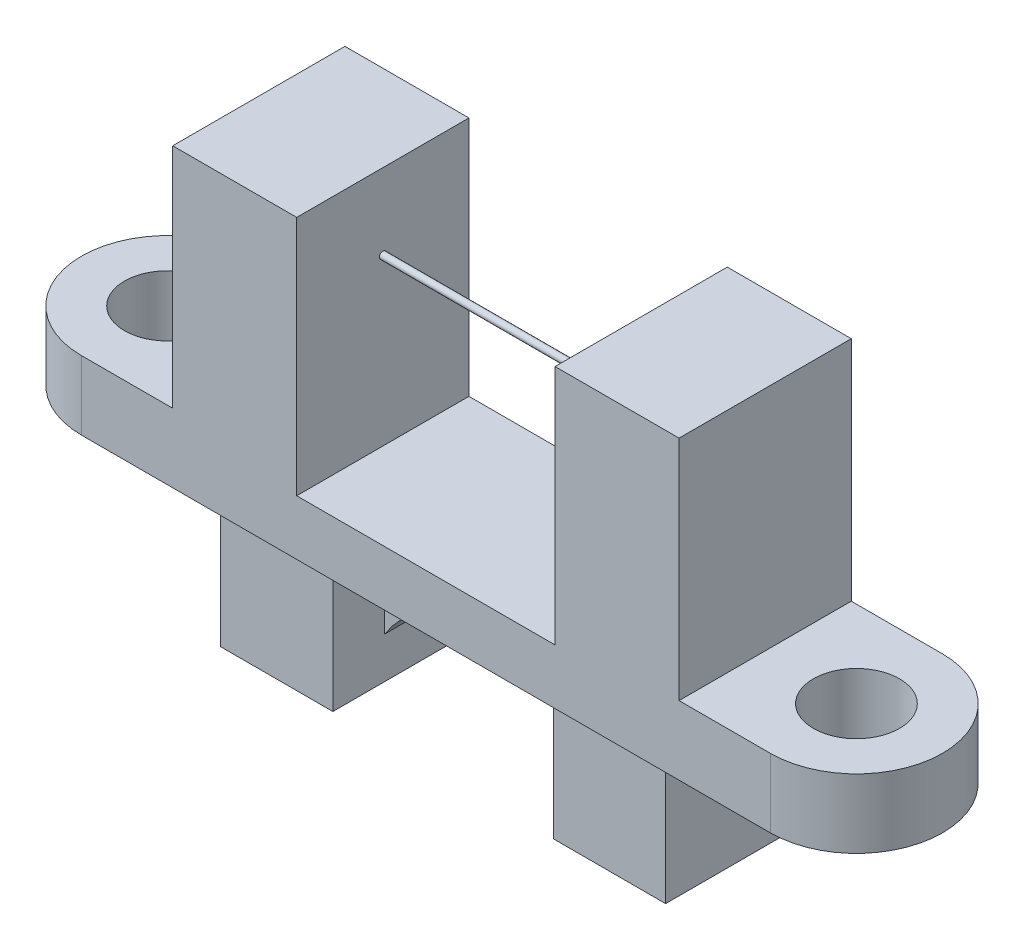
ISO-10303-21;
HEADER;
FILE_DESCRIPTION(('STEP AP214'),'2;1');
FILE_NAME('part.step','',(''),(''),'','','');
FILE_SCHEMA(('AUTOMOTIVE_DESIGN { 1 0 10303 214 1 1 1 1 }'));
ENDSEC;
DATA;
#1=APPLICATION_CONTEXT('core data for automotive mechanical design processes');
#2=APPLICATION_PROTOCOL_DEFINITION('international standard','automotive_design',2000,#1);
#3=PRODUCT_CONTEXT('',#1,'mechanical');
#4=PRODUCT('Part','Part','',(#3));
#5=PRODUCT_RELATED_PRODUCT_CATEGORY('part','',(#4));
#6=PRODUCT_DEFINITION_FORMATION('','',#4);
#7=PRODUCT_DEFINITION_CONTEXT('part definition',#1,'design');
#8=PRODUCT_DEFINITION('design','',#6,#7);
#9=PRODUCT_DEFINITION_SHAPE('','',#8);
#10=(LENGTH_UNIT() NAMED_UNIT(*) SI_UNIT(.MILLI.,.METRE.));
#11=(NAMED_UNIT(*) PLANE_ANGLE_UNIT() SI_UNIT($,.RADIAN.));
#12=(NAMED_UNIT(*) SI_UNIT($,.STERADIAN.) SOLID_ANGLE_UNIT());
#13=UNCERTAINTY_MEASURE_WITH_UNIT(LENGTH_MEASURE(1.E-05),#10,'distance_accuracy_value','');
#14=(GEOMETRIC_REPRESENTATION_CONTEXT(3) GLOBAL_UNCERTAINTY_ASSIGNED_CONTEXT((#13)) GLOBAL_UNIT_ASSIGNED_CONTEXT((#10,
#11,#12)) REPRESENTATION_CONTEXT('',''));
#15=CARTESIAN_POINT('',(0.,0.,0.));
#16=DIRECTION('',(0.,0.,1.));
#17=DIRECTION('',(1.,0.,0.));
#18=AXIS2_PLACEMENT_3D('',#15,#16,#17);
#19=CARTESIAN_POINT('',(4.7625,2.032,-3.175));
#20=DIRECTION('',(1.,0.,0.));
#21=DIRECTION('',(0.,0.,-1.));
#22=AXIS2_PLACEMENT_3D('',#19,#20,#21);
#23=PLANE('',#22);
#24=DIRECTION('',(0.,1.,0.));
#25=VECTOR('',#24,1.);
#26=CARTESIAN_POINT('',(4.7625,2.032,3.175));
#27=LINE('',#26,#25);
#28=CARTESIAN_POINT('',(4.7625,2.032,3.175));
#29=VERTEX_POINT('',#28);
#30=CARTESIAN_POINT('',(4.7625,10.922,3.175));
#31=VERTEX_POINT('',#30);
#32=EDGE_CURVE('E354',#29,#31,#27,.T.);
#33=ORIENTED_EDGE('',*,*,#32,.T.);
#34=DIRECTION('',(0.,0.,1.));
#35=VECTOR('',#34,1.);
#36=CARTESIAN_POINT('',(4.7625,10.922,-3.175));
#37=LINE('',#36,#35);
#38=CARTESIAN_POINT('',(4.7625,10.922,-3.175));
#39=VERTEX_POINT('',#38);
#40=EDGE_CURVE('E324',#39,#31,#37,.T.);
#41=ORIENTED_EDGE('',*,*,#40,.F.);
#42=DIRECTION('',(0.,1.,0.));
#43=VECTOR('',#42,1.);
#44=CARTESIAN_POINT('',(4.7625,2.032,-3.175));
#45=LINE('',#44,#43);
#46=CARTESIAN_POINT('',(4.7625,2.032,-3.175));
#47=VERTEX_POINT('',#46);
#48=EDGE_CURVE('E353',#47,#39,#45,.T.);
#49=ORIENTED_EDGE('',*,*,#48,.F.);
#50=DIRECTION('',(0.,0.,-1.));
#51=VECTOR('',#50,1.);
#52=CARTESIAN_POINT('',(4.7625,2.032,-3.175));
#53=LINE('',#52,#51);
#54=EDGE_CURVE('E341',#29,#47,#53,.T.);
#55=ORIENTED_EDGE('',*,*,#54,.F.);
#56=EDGE_LOOP('',(#33,#41,#49,#55));
#57=FACE_BOUND('',#56,.T.);
#58=CARTESIAN_POINT('',(4.7625,8.128,0.));
#59=DIRECTION('',(1.,0.,0.));
#60=DIRECTION('',(0.,0.,-1.));
#61=AXIS2_PLACEMENT_3D('',#58,#59,#60);
#62=CIRCLE('',#61,0.127);
#63=CARTESIAN_POINT('',(4.7625,8.128,-0.126999999999999));
#64=VERTEX_POINT('',#63);
#65=EDGE_CURVE('E11',#64,#64,#62,.F.);
#66=ORIENTED_EDGE('',*,*,#65,.F.);
#67=EDGE_LOOP('',(#66));
#68=FACE_BOUND('',#67,.T.);
#69=ADVANCED_FACE('F36',(#57,#68),#23,.F.);
#70=CARTESIAN_POINT('',(-4.7625,2.032,-3.175));
#71=DIRECTION('',(-1.,0.,0.));
#72=DIRECTION('',(0.,0.,1.));
#73=AXIS2_PLACEMENT_3D('',#70,#71,#72);
#74=PLANE('',#73);
#75=DIRECTION('',(0.,1.,0.));
#76=VECTOR('',#75,1.);
#77=CARTESIAN_POINT('',(-4.7625,2.032,-3.175));
#78=LINE('',#77,#76);
#79=CARTESIAN_POINT('',(-4.7625,2.032,-3.175));
#80=VERTEX_POINT('',#79);
#81=CARTESIAN_POINT('',(-4.7625,10.922,-3.175));
#82=VERTEX_POINT('',#81);
#83=EDGE_CURVE('E360',#80,#82,#78,.T.);
#84=ORIENTED_EDGE('',*,*,#83,.T.);
#85=DIRECTION('',(0.,0.,-1.));
#86=VECTOR('',#85,1.);
#87=CARTESIAN_POINT('',(-4.7625,10.922,-3.175));
#88=LINE('',#87,#86);
#89=CARTESIAN_POINT('',(-4.7625,10.922,3.175));
#90=VERTEX_POINT('',#89);
#91=EDGE_CURVE('E314',#90,#82,#88,.T.);
#92=ORIENTED_EDGE('',*,*,#91,.F.);
#93=DIRECTION('',(0.,1.,0.));
#94=VECTOR('',#93,1.);
#95=CARTESIAN_POINT('',(-4.7625,2.032,3.175));
#96=LINE('',#95,#94);
#97=CARTESIAN_POINT('',(-4.7625,2.032,3.175));
#98=VERTEX_POINT('',#97);
#99=EDGE_CURVE('E358',#98,#90,#96,.T.);
#100=ORIENTED_EDGE('',*,*,#99,.F.);
#101=DIRECTION('',(0.,0.,1.));
#102=VECTOR('',#101,1.);
#103=CARTESIAN_POINT('',(-4.7625,2.032,-3.175));
#104=LINE('',#103,#102);
#105=EDGE_CURVE('E347',#80,#98,#104,.T.);
#106=ORIENTED_EDGE('',*,*,#105,.F.);
#107=EDGE_LOOP('',(#84,#92,#100,#106));
#108=FACE_BOUND('',#107,.T.);
#109=CARTESIAN_POINT('',(-4.7625,8.128,0.));
#110=DIRECTION('',(-1.,0.,0.));
#111=DIRECTION('',(0.,0.,1.));
#112=AXIS2_PLACEMENT_3D('',#109,#110,#111);
#113=CIRCLE('',#112,0.127);
#114=CARTESIAN_POINT('',(-4.7625,8.128,0.126999999999999));
#115=VERTEX_POINT('',#114);
#116=EDGE_CURVE('E44',#115,#115,#113,.F.);
#117=ORIENTED_EDGE('',*,*,#116,.F.);
#118=EDGE_LOOP('',(#117));
#119=FACE_BOUND('',#118,.T.);
#120=ADVANCED_FACE('F400',(#108,#119),#74,.F.);
#121=CARTESIAN_POINT('',(12.7,0.,0.));
#122=DIRECTION('',(0.,1.,0.));
#123=DIRECTION('',(0.,0.,1.));
#124=AXIS2_PLACEMENT_3D('',#121,#122,#123);
#125=PLANE('',#124);
#126=CARTESIAN_POINT('',(-12.7,0.,0.));
#127=DIRECTION('',(0.,1.,0.));
#128=DIRECTION('',(0.,0.,-1.));
#129=AXIS2_PLACEMENT_3D('',#126,#127,#128);
#130=CIRCLE('',#129,1.5875);
#131=CARTESIAN_POINT('',(-12.7,0.,-1.5875));
#132=VERTEX_POINT('',#131);
#133=EDGE_CURVE('E294',#132,#132,#130,.T.);
#134=ORIENTED_EDGE('',*,*,#133,.T.);
#135=EDGE_LOOP('',(#134));
#136=FACE_BOUND('',#135,.T.);
#137=CARTESIAN_POINT('',(12.7,0.,0.));
#138=DIRECTION('',(0.,1.,0.));
#139=DIRECTION('',(0.,0.,1.));
#140=AXIS2_PLACEMENT_3D('',#137,#138,#139);
#141=CIRCLE('',#140,1.5875);
#142=CARTESIAN_POINT('',(12.7,0.,1.5875));
#143=VERTEX_POINT('',#142);
#144=EDGE_CURVE('E300',#143,#143,#141,.T.);
#145=ORIENTED_EDGE('',*,*,#144,.T.);
#146=EDGE_LOOP('',(#145));
#147=FACE_BOUND('',#146,.T.);
#148=CARTESIAN_POINT('',(12.7,0.,0.));
#149=DIRECTION('',(0.,1.,0.));
#150=DIRECTION('',(0.,0.,1.));
#151=AXIS2_PLACEMENT_3D('',#148,#149,#150);
#152=CIRCLE('',#151,3.175);
#153=CARTESIAN_POINT('',(12.7,0.,3.175));
#154=VERTEX_POINT('',#153);
#155=CARTESIAN_POINT('',(12.7,0.,-3.175));
#156=VERTEX_POINT('',#155);
#157=EDGE_CURVE('E357',#154,#156,#152,.T.);
#158=ORIENTED_EDGE('',*,*,#157,.F.);
#159=DIRECTION('',(1.,0.,0.));
#160=VECTOR('',#159,1.);
#161=CARTESIAN_POINT('',(12.7,0.,3.175));
#162=LINE('',#161,#160);
#163=CARTESIAN_POINT('',(-12.7,0.,3.175));
#164=VERTEX_POINT('',#163);
#165=EDGE_CURVE('E367',#164,#154,#162,.T.);
#166=ORIENTED_EDGE('',*,*,#165,.F.);
#167=CARTESIAN_POINT('',(-12.7,0.,0.));
#168=DIRECTION('',(0.,1.,0.));
#169=DIRECTION('',(0.,0.,-1.));
#170=AXIS2_PLACEMENT_3D('',#167,#168,#169);
#171=CIRCLE('',#170,3.175);
#172=CARTESIAN_POINT('',(-12.7,0.,-3.175));
#173=VERTEX_POINT('',#172);
#174=EDGE_CURVE('E382',#173,#164,#171,.T.);
#175=ORIENTED_EDGE('',*,*,#174,.F.);
#176=DIRECTION('',(-1.,0.,0.));
#177=VECTOR('',#176,1.);
#178=CARTESIAN_POINT('',(12.7,0.,-3.175));
#179=LINE('',#178,#177);
#180=EDGE_CURVE('E380',#156,#173,#179,.T.);
#181=ORIENTED_EDGE('',*,*,#180,.F.);
#182=EDGE_LOOP('',(#158,#166,#175,#181));
#183=FACE_BOUND('',#182,.T.);
#184=DIRECTION('',(0.,0.,-1.));
#185=VECTOR('',#184,1.);
#186=CARTESIAN_POINT('',(4.064,0.,-2.54));
#187=LINE('',#186,#185);
#188=CARTESIAN_POINT('',(4.064,0.,-0.635));
#189=VERTEX_POINT('',#188);
#190=CARTESIAN_POINT('',(4.064,0.,-2.54));
#191=VERTEX_POINT('',#190);
#192=EDGE_CURVE('E207',#189,#191,#187,.T.);
#193=ORIENTED_EDGE('',*,*,#192,.F.);
#194=DIRECTION('',(-1.,0.,0.));
#195=VECTOR('',#194,1.);
#196=CARTESIAN_POINT('',(-4.064,0.,-0.635));
#197=LINE('',#196,#195);
#198=CARTESIAN_POINT('',(-4.064,0.,-0.635));
#199=VERTEX_POINT('',#198);
#200=EDGE_CURVE('E233',#189,#199,#197,.T.);
#201=ORIENTED_EDGE('',*,*,#200,.T.);
#202=DIRECTION('',(0.,0.,1.));
#203=VECTOR('',#202,1.);
#204=CARTESIAN_POINT('',(-4.064,0.,-2.54));
#205=LINE('',#204,#203);
#206=CARTESIAN_POINT('',(-4.064,0.,-2.54));
#207=VERTEX_POINT('',#206);
#208=EDGE_CURVE('E270',#207,#199,#205,.T.);
#209=ORIENTED_EDGE('',*,*,#208,.F.);
#210=DIRECTION('',(1.,0.,0.));
#211=VECTOR('',#210,1.);
#212=CARTESIAN_POINT('',(-4.064,0.,-2.54));
#213=LINE('',#212,#211);
#214=CARTESIAN_POINT('',(-8.2042,0.,-2.54));
#215=VERTEX_POINT('',#214);
#216=EDGE_CURVE('E263',#215,#207,#213,.T.);
#217=ORIENTED_EDGE('',*,*,#216,.F.);
#218=DIRECTION('',(0.,0.,-1.));
#219=VECTOR('',#218,1.);
#220=CARTESIAN_POINT('',(-8.2042,0.,-2.54));
#221=LINE('',#220,#219);
#222=CARTESIAN_POINT('',(-8.2042,0.,2.54));
#223=VERTEX_POINT('',#222);
#224=EDGE_CURVE('E275',#223,#215,#221,.T.);
#225=ORIENTED_EDGE('',*,*,#224,.F.);
#226=DIRECTION('',(-1.,0.,0.));
#227=VECTOR('',#226,1.);
#228=CARTESIAN_POINT('',(-4.064,0.,2.54));
#229=LINE('',#228,#227);
#230=CARTESIAN_POINT('',(-4.06400000000001,0.,2.54));
#231=VERTEX_POINT('',#230);
#232=EDGE_CURVE('E272',#231,#223,#229,.T.);
#233=ORIENTED_EDGE('',*,*,#232,.F.);
#234=CARTESIAN_POINT('',(-4.064,0.,0.635));
#235=VERTEX_POINT('',#234);
#236=EDGE_CURVE('E215',#235,#231,#205,.T.);
#237=ORIENTED_EDGE('',*,*,#236,.F.);
#238=DIRECTION('',(-1.,0.,0.));
#239=VECTOR('',#238,1.);
#240=CARTESIAN_POINT('',(-4.064,0.,0.635));
#241=LINE('',#240,#239);
#242=CARTESIAN_POINT('',(4.064,0.,0.635));
#243=VERTEX_POINT('',#242);
#244=EDGE_CURVE('E211',#243,#235,#241,.T.);
#245=ORIENTED_EDGE('',*,*,#244,.F.);
#246=CARTESIAN_POINT('',(4.064,0.,2.54));
#247=VERTEX_POINT('',#246);
#248=EDGE_CURVE('E195',#247,#243,#187,.T.);
#249=ORIENTED_EDGE('',*,*,#248,.F.);
#250=DIRECTION('',(-1.,0.,0.));
#251=VECTOR('',#250,1.);
#252=CARTESIAN_POINT('',(4.064,0.,2.54));
#253=LINE('',#252,#251);
#254=CARTESIAN_POINT('',(8.2042,0.,2.54));
#255=VERTEX_POINT('',#254);
#256=EDGE_CURVE('E246',#255,#247,#253,.T.);
#257=ORIENTED_EDGE('',*,*,#256,.F.);
#258=DIRECTION('',(0.,0.,1.));
#259=VECTOR('',#258,1.);
#260=CARTESIAN_POINT('',(8.2042,0.,-2.54));
#261=LINE('',#260,#259);
#262=CARTESIAN_POINT('',(8.2042,0.,-2.54));
#263=VERTEX_POINT('',#262);
#264=EDGE_CURVE('E231',#263,#255,#261,.T.);
#265=ORIENTED_EDGE('',*,*,#264,.F.);
#266=DIRECTION('',(1.,0.,0.));
#267=VECTOR('',#266,1.);
#268=CARTESIAN_POINT('',(4.064,0.,-2.54));
#269=LINE('',#268,#267);
#270=EDGE_CURVE('E206',#191,#263,#269,.T.);
#271=ORIENTED_EDGE('',*,*,#270,.F.);
#272=EDGE_LOOP('',(#193,#201,#209,#217,#225,#233,#237,#245,#249,#257,#265,#271));
#273=FACE_BOUND('',#272,.T.);
#274=ADVANCED_FACE('F213',(#136,#147,#183,#273),#125,.F.);
#275=CARTESIAN_POINT('',(12.7,2.54,0.));
#276=DIRECTION('',(0.,1.,0.));
#277=DIRECTION('',(0.,0.,1.));
#278=AXIS2_PLACEMENT_3D('',#275,#276,#277);
#279=PLANE('',#278);
#280=CARTESIAN_POINT('',(-12.7,2.54,0.));
#281=DIRECTION('',(0.,1.,0.));
#282=DIRECTION('',(0.,0.,-1.));
#283=AXIS2_PLACEMENT_3D('',#280,#281,#282);
#284=CIRCLE('',#283,1.5875);
#285=CARTESIAN_POINT('',(-12.7,2.54,-1.5875));
#286=VERTEX_POINT('',#285);
#287=EDGE_CURVE('E293',#286,#286,#284,.T.);
#288=ORIENTED_EDGE('',*,*,#287,.F.);
#289=EDGE_LOOP('',(#288));
#290=FACE_BOUND('',#289,.T.);
#291=DIRECTION('',(1.,0.,0.));
#292=VECTOR('',#291,1.);
#293=CARTESIAN_POINT('',(12.7,2.54,3.175));
#294=LINE('',#293,#292);
#295=CARTESIAN_POINT('',(-12.7,2.54,3.175));
#296=VERTEX_POINT('',#295);
#297=CARTESIAN_POINT('',(-9.3345,2.54,3.175));
#298=VERTEX_POINT('',#297);
#299=EDGE_CURVE('E374',#296,#298,#294,.T.);
#300=ORIENTED_EDGE('',*,*,#299,.T.);
#301=DIRECTION('',(0.,0.,1.));
#302=VECTOR('',#301,1.);
#303=CARTESIAN_POINT('',(-9.3345,2.54,-3.175));
#304=LINE('',#303,#302);
#305=CARTESIAN_POINT('',(-9.3345,2.54,-3.175));
#306=VERTEX_POINT('',#305);
#307=EDGE_CURVE('E303',#306,#298,#304,.T.);
#308=ORIENTED_EDGE('',*,*,#307,.F.);
#309=DIRECTION('',(-1.,0.,0.));
#310=VECTOR('',#309,1.);
#311=CARTESIAN_POINT('',(12.7,2.54,-3.175));
#312=LINE('',#311,#310);
#313=CARTESIAN_POINT('',(-12.7,2.54,-3.175));
#314=VERTEX_POINT('',#313);
#315=EDGE_CURVE('E366',#306,#314,#312,.T.);
#316=ORIENTED_EDGE('',*,*,#315,.T.);
#317=CARTESIAN_POINT('',(-12.7,2.54,0.));
#318=DIRECTION('',(0.,1.,0.));
#319=DIRECTION('',(0.,0.,-1.));
#320=AXIS2_PLACEMENT_3D('',#317,#318,#319);
#321=CIRCLE('',#320,3.175);
#322=EDGE_CURVE('E371',#314,#296,#321,.T.);
#323=ORIENTED_EDGE('',*,*,#322,.T.);
#324=EDGE_LOOP('',(#300,#308,#316,#323));
#325=FACE_BOUND('',#324,.T.);
#326=ADVANCED_FACE('F408',(#290,#325),#279,.T.);
#327=CARTESIAN_POINT('',(12.7,2.54,0.));
#328=DIRECTION('',(0.,1.,0.));
#329=DIRECTION('',(0.,0.,1.));
#330=AXIS2_PLACEMENT_3D('',#327,#328,#329);
#331=CIRCLE('',#330,1.5875);
#332=CARTESIAN_POINT('',(12.7,2.54,1.5875));
#333=VERTEX_POINT('',#332);
#334=EDGE_CURVE('E297',#333,#333,#331,.T.);
#335=ORIENTED_EDGE('',*,*,#334,.F.);
#336=EDGE_LOOP('',(#335));
#337=FACE_BOUND('',#336,.T.);
#338=CARTESIAN_POINT('',(12.7,2.54,-3.175));
#339=VERTEX_POINT('',#338);
#340=CARTESIAN_POINT('',(9.3345,2.54,-3.175));
#341=VERTEX_POINT('',#340);
#342=EDGE_CURVE('E368',#339,#341,#312,.T.);
#343=ORIENTED_EDGE('',*,*,#342,.T.);
#344=DIRECTION('',(0.,0.,-1.));
#345=VECTOR('',#344,1.);
#346=CARTESIAN_POINT('',(9.3345,2.54,-3.175));
#347=LINE('',#346,#345);
#348=CARTESIAN_POINT('',(9.3345,2.54,3.175));
#349=VERTEX_POINT('',#348);
#350=EDGE_CURVE('E323',#349,#341,#347,.T.);
#351=ORIENTED_EDGE('',*,*,#350,.F.);
#352=CARTESIAN_POINT('',(12.7,2.54,3.175));
#353=VERTEX_POINT('',#352);
#354=EDGE_CURVE('E373',#349,#353,#294,.T.);
#355=ORIENTED_EDGE('',*,*,#354,.T.);
#356=CARTESIAN_POINT('',(12.7,2.54,0.));
#357=DIRECTION('',(0.,1.,0.));
#358=DIRECTION('',(0.,0.,1.));
#359=AXIS2_PLACEMENT_3D('',#356,#357,#358);
#360=CIRCLE('',#359,3.175);
#361=EDGE_CURVE('E363',#353,#339,#360,.T.);
#362=ORIENTED_EDGE('',*,*,#361,.T.);
#363=EDGE_LOOP('',(#343,#351,#355,#362));
#364=FACE_BOUND('',#363,.T.);
#365=ADVANCED_FACE('F418',(#337,#364),#279,.T.);
#366=CARTESIAN_POINT('',(12.7,2.54,0.));
#367=DIRECTION('',(0.,-1.,0.));
#368=DIRECTION('',(0.,0.,-1.));
#369=AXIS2_PLACEMENT_3D('',#366,#367,#368);
#370=CYLINDRICAL_SURFACE('',#369,3.175);
#371=ORIENTED_EDGE('',*,*,#157,.T.);
#372=DIRECTION('',(0.,-1.,0.));
#373=VECTOR('',#372,1.);
#374=CARTESIAN_POINT('',(12.7,2.54,-3.175));
#375=LINE('',#374,#373);
#376=EDGE_CURVE('E393',#339,#156,#375,.T.);
#377=ORIENTED_EDGE('',*,*,#376,.F.);
#378=ORIENTED_EDGE('',*,*,#361,.F.);
#379=DIRECTION('',(0.,-1.,0.));
#380=VECTOR('',#379,1.);
#381=CARTESIAN_POINT('',(12.7,2.54,3.175));
#382=LINE('',#381,#380);
#383=EDGE_CURVE('E377',#353,#154,#382,.T.);
#384=ORIENTED_EDGE('',*,*,#383,.T.);
#385=EDGE_LOOP('',(#371,#377,#378,#384));
#386=FACE_BOUND('',#385,.T.);
#387=ADVANCED_FACE('F38',(#386),#370,.T.);
#388=CARTESIAN_POINT('',(12.7,2.54,-3.175));
#389=DIRECTION('',(0.,0.,1.));
#390=DIRECTION('',(1.,0.,0.));
#391=AXIS2_PLACEMENT_3D('',#388,#389,#390);
#392=PLANE('',#391);
#393=DIRECTION('',(-1.,0.,0.));
#394=VECTOR('',#393,1.);
#395=CARTESIAN_POINT('',(-4.7625,2.032,-3.175));
#396=LINE('',#395,#394);
#397=EDGE_CURVE('E344',#47,#80,#396,.T.);
#398=ORIENTED_EDGE('',*,*,#397,.F.);
#399=ORIENTED_EDGE('',*,*,#48,.T.);
#400=DIRECTION('',(-1.,0.,0.));
#401=VECTOR('',#400,1.);
#402=CARTESIAN_POINT('',(4.7625,10.922,-3.175));
#403=LINE('',#402,#401);
#404=CARTESIAN_POINT('',(9.3345,10.922,-3.175));
#405=VERTEX_POINT('',#404);
#406=EDGE_CURVE('E331',#405,#39,#403,.T.);
#407=ORIENTED_EDGE('',*,*,#406,.F.);
#408=DIRECTION('',(0.,-1.,0.));
#409=VECTOR('',#408,1.);
#410=CARTESIAN_POINT('',(9.3345,10.922,-3.175));
#411=LINE('',#410,#409);
#412=EDGE_CURVE('E334',#405,#341,#411,.T.);
#413=ORIENTED_EDGE('',*,*,#412,.T.);
#414=ORIENTED_EDGE('',*,*,#342,.F.);
#415=ORIENTED_EDGE('',*,*,#376,.T.);
#416=ORIENTED_EDGE('',*,*,#180,.T.);
#417=DIRECTION('',(0.,-1.,0.));
#418=VECTOR('',#417,1.);
#419=CARTESIAN_POINT('',(-12.7,2.54,-3.175));
#420=LINE('',#419,#418);
#421=EDGE_CURVE('E390',#314,#173,#420,.T.);
#422=ORIENTED_EDGE('',*,*,#421,.F.);
#423=ORIENTED_EDGE('',*,*,#315,.F.);
#424=DIRECTION('',(0.,-1.,0.));
#425=VECTOR('',#424,1.);
#426=CARTESIAN_POINT('',(-9.3345,10.922,-3.175));
#427=LINE('',#426,#425);
#428=CARTESIAN_POINT('',(-9.3345,10.922,-3.175));
#429=VERTEX_POINT('',#428);
#430=EDGE_CURVE('E321',#429,#306,#427,.T.);
#431=ORIENTED_EDGE('',*,*,#430,.F.);
#432=DIRECTION('',(-1.,0.,0.));
#433=VECTOR('',#432,1.);
#434=CARTESIAN_POINT('',(-4.7625,10.922,-3.175));
#435=LINE('',#434,#433);
#436=EDGE_CURVE('E306',#82,#429,#435,.T.);
#437=ORIENTED_EDGE('',*,*,#436,.F.);
#438=ORIENTED_EDGE('',*,*,#83,.F.);
#439=EDGE_LOOP('',(#398,#399,#407,#413,#414,#415,#416,#422,#423,#431,#437,#438));
#440=FACE_BOUND('',#439,.T.);
#441=ADVANCED_FACE('F427',(#440),#392,.F.);
#442=CARTESIAN_POINT('',(-12.7,2.54,0.));
#443=DIRECTION('',(0.,-1.,0.));
#444=DIRECTION('',(0.,0.,-1.));
#445=AXIS2_PLACEMENT_3D('',#442,#443,#444);
#446=CYLINDRICAL_SURFACE('',#445,3.175);
#447=ORIENTED_EDGE('',*,*,#174,.T.);
#448=DIRECTION('',(0.,-1.,0.));
#449=VECTOR('',#448,1.);
#450=CARTESIAN_POINT('',(-12.7,2.54,3.175));
#451=LINE('',#450,#449);
#452=EDGE_CURVE('E387',#296,#164,#451,.T.);
#453=ORIENTED_EDGE('',*,*,#452,.F.);
#454=ORIENTED_EDGE('',*,*,#322,.F.);
#455=ORIENTED_EDGE('',*,*,#421,.T.);
#456=EDGE_LOOP('',(#447,#453,#454,#455));
#457=FACE_BOUND('',#456,.T.);
#458=ADVANCED_FACE('F424',(#457),#446,.T.);
#459=CARTESIAN_POINT('',(12.7,2.54,3.175));
#460=DIRECTION('',(0.,0.,-1.));
#461=DIRECTION('',(-1.,0.,0.));
#462=AXIS2_PLACEMENT_3D('',#459,#460,#461);
#463=PLANE('',#462);
#464=ORIENTED_EDGE('',*,*,#354,.F.);
#465=DIRECTION('',(0.,-1.,0.));
#466=VECTOR('',#465,1.);
#467=CARTESIAN_POINT('',(9.3345,10.922,3.175));
#468=LINE('',#467,#466);
#469=CARTESIAN_POINT('',(9.3345,10.922,3.175));
#470=VERTEX_POINT('',#469);
#471=EDGE_CURVE('E338',#470,#349,#468,.T.);
#472=ORIENTED_EDGE('',*,*,#471,.F.);
#473=DIRECTION('',(1.,0.,0.));
#474=VECTOR('',#473,1.);
#475=CARTESIAN_POINT('',(4.7625,10.922,3.175));
#476=LINE('',#475,#474);
#477=EDGE_CURVE('E327',#31,#470,#476,.T.);
#478=ORIENTED_EDGE('',*,*,#477,.F.);
#479=ORIENTED_EDGE('',*,*,#32,.F.);
#480=DIRECTION('',(1.,0.,0.));
#481=VECTOR('',#480,1.);
#482=CARTESIAN_POINT('',(-4.7625,2.032,3.175));
#483=LINE('',#482,#481);
#484=EDGE_CURVE('E350',#98,#29,#483,.T.);
#485=ORIENTED_EDGE('',*,*,#484,.F.);
#486=ORIENTED_EDGE('',*,*,#99,.T.);
#487=DIRECTION('',(1.,0.,0.));
#488=VECTOR('',#487,1.);
#489=CARTESIAN_POINT('',(-4.7625,10.922,3.175));
#490=LINE('',#489,#488);
#491=CARTESIAN_POINT('',(-9.3345,10.922,3.175));
#492=VERTEX_POINT('',#491);
#493=EDGE_CURVE('E311',#492,#90,#490,.T.);
#494=ORIENTED_EDGE('',*,*,#493,.F.);
#495=DIRECTION('',(0.,-1.,0.));
#496=VECTOR('',#495,1.);
#497=CARTESIAN_POINT('',(-9.3345,10.922,3.175));
#498=LINE('',#497,#496);
#499=EDGE_CURVE('E317',#492,#298,#498,.T.);
#500=ORIENTED_EDGE('',*,*,#499,.T.);
#501=ORIENTED_EDGE('',*,*,#299,.F.);
#502=ORIENTED_EDGE('',*,*,#452,.T.);
#503=ORIENTED_EDGE('',*,*,#165,.T.);
#504=ORIENTED_EDGE('',*,*,#383,.F.);
#505=EDGE_LOOP('',(#464,#472,#478,#479,#485,#486,#494,#500,#501,#502,#503,#504));
#506=FACE_BOUND('',#505,.T.);
#507=ADVANCED_FACE('F421',(#506),#463,.F.);
#508=CARTESIAN_POINT('',(4.7625,2.032,-3.175));
#509=DIRECTION('',(0.,1.,0.));
#510=DIRECTION('',(0.,0.,1.));
#511=AXIS2_PLACEMENT_3D('',#508,#509,#510);
#512=PLANE('',#511);
#513=ORIENTED_EDGE('',*,*,#54,.T.);
#514=ORIENTED_EDGE('',*,*,#397,.T.);
#515=ORIENTED_EDGE('',*,*,#105,.T.);
#516=ORIENTED_EDGE('',*,*,#484,.T.);
#517=EDGE_LOOP('',(#513,#514,#515,#516));
#518=FACE_BOUND('',#517,.T.);
#519=ADVANCED_FACE('F414',(#518),#512,.T.);
#520=CARTESIAN_POINT('',(9.3345,10.922,-3.175));
#521=DIRECTION('',(-1.,0.,0.));
#522=DIRECTION('',(0.,0.,1.));
#523=AXIS2_PLACEMENT_3D('',#520,#521,#522);
#524=PLANE('',#523);
#525=ORIENTED_EDGE('',*,*,#350,.T.);
#526=ORIENTED_EDGE('',*,*,#412,.F.);
#527=DIRECTION('',(0.,0.,-1.));
#528=VECTOR('',#527,1.);
#529=CARTESIAN_POINT('',(9.3345,10.922,-3.175));
#530=LINE('',#529,#528);
#531=EDGE_CURVE('E329',#470,#405,#530,.T.);
#532=ORIENTED_EDGE('',*,*,#531,.F.);
#533=ORIENTED_EDGE('',*,*,#471,.T.);
#534=EDGE_LOOP('',(#525,#526,#532,#533));
#535=FACE_BOUND('',#534,.T.);
#536=ADVANCED_FACE('F476',(#535),#524,.F.);
#537=CARTESIAN_POINT('',(4.7625,10.922,3.175));
#538=DIRECTION('',(0.,1.,0.));
#539=DIRECTION('',(0.,0.,1.));
#540=AXIS2_PLACEMENT_3D('',#537,#538,#539);
#541=PLANE('',#540);
#542=ORIENTED_EDGE('',*,*,#40,.T.);
#543=ORIENTED_EDGE('',*,*,#477,.T.);
#544=ORIENTED_EDGE('',*,*,#531,.T.);
#545=ORIENTED_EDGE('',*,*,#406,.T.);
#546=EDGE_LOOP('',(#542,#543,#544,#545));
#547=FACE_BOUND('',#546,.T.);
#548=ADVANCED_FACE('F446',(#547),#541,.T.);
#549=CARTESIAN_POINT('',(-9.3345,10.922,-3.175));
#550=DIRECTION('',(1.,0.,0.));
#551=DIRECTION('',(0.,0.,-1.));
#552=AXIS2_PLACEMENT_3D('',#549,#550,#551);
#553=PLANE('',#552);
#554=ORIENTED_EDGE('',*,*,#307,.T.);
#555=ORIENTED_EDGE('',*,*,#499,.F.);
#556=DIRECTION('',(0.,0.,1.));
#557=VECTOR('',#556,1.);
#558=CARTESIAN_POINT('',(-9.3345,10.922,-3.175));
#559=LINE('',#558,#557);
#560=EDGE_CURVE('E309',#429,#492,#559,.T.);
#561=ORIENTED_EDGE('',*,*,#560,.F.);
#562=ORIENTED_EDGE('',*,*,#430,.T.);
#563=EDGE_LOOP('',(#554,#555,#561,#562));
#564=FACE_BOUND('',#563,.T.);
#565=ADVANCED_FACE('F472',(#564),#553,.F.);
#566=CARTESIAN_POINT('',(-9.3345,10.922,-3.175));
#567=DIRECTION('',(0.,1.,0.));
#568=DIRECTION('',(0.,0.,1.));
#569=AXIS2_PLACEMENT_3D('',#566,#567,#568);
#570=PLANE('',#569);
#571=ORIENTED_EDGE('',*,*,#436,.T.);
#572=ORIENTED_EDGE('',*,*,#560,.T.);
#573=ORIENTED_EDGE('',*,*,#493,.T.);
#574=ORIENTED_EDGE('',*,*,#91,.T.);
#575=EDGE_LOOP('',(#571,#572,#573,#574));
#576=FACE_BOUND('',#575,.T.);
#577=ADVANCED_FACE('F474',(#576),#570,.T.);
#578=CARTESIAN_POINT('',(12.7,0.,0.));
#579=DIRECTION('',(0.,1.,0.));
#580=DIRECTION('',(0.,0.,1.));
#581=AXIS2_PLACEMENT_3D('',#578,#579,#580);
#582=CYLINDRICAL_SURFACE('',#581,1.5875);
#583=ORIENTED_EDGE('',*,*,#144,.F.);
#584=EDGE_LOOP('',(#583));
#585=FACE_BOUND('',#584,.T.);
#586=ORIENTED_EDGE('',*,*,#334,.T.);
#587=EDGE_LOOP('',(#586));
#588=FACE_BOUND('',#587,.T.);
#589=ADVANCED_FACE('F488',(#585,#588),#582,.F.);
#590=CARTESIAN_POINT('',(-12.7,0.,0.));
#591=DIRECTION('',(0.,1.,0.));
#592=DIRECTION('',(0.,0.,1.));
#593=AXIS2_PLACEMENT_3D('',#590,#591,#592);
#594=CYLINDRICAL_SURFACE('',#593,1.5875);
#595=ORIENTED_EDGE('',*,*,#133,.F.);
#596=EDGE_LOOP('',(#595));
#597=FACE_BOUND('',#596,.T.);
#598=ORIENTED_EDGE('',*,*,#287,.T.);
#599=EDGE_LOOP('',(#598));
#600=FACE_BOUND('',#599,.T.);
#601=ADVANCED_FACE('F491',(#597,#600),#594,.F.);
#602=CARTESIAN_POINT('',(-4.064,-4.826,-2.54));
#603=DIRECTION('',(-1.,0.,0.));
#604=DIRECTION('',(0.,0.,1.));
#605=AXIS2_PLACEMENT_3D('',#602,#603,#604);
#606=PLANE('',#605);
#607=ORIENTED_EDGE('',*,*,#208,.T.);
#608=DIRECTION('',(0.,-1.,0.));
#609=VECTOR('',#608,1.);
#610=CARTESIAN_POINT('',(-4.064,0.,-0.635));
#611=LINE('',#610,#609);
#612=CARTESIAN_POINT('',(-4.064,-3.30536196671666,-0.635));
#613=VERTEX_POINT('',#612);
#614=EDGE_CURVE('E51',#199,#613,#611,.T.);
#615=ORIENTED_EDGE('',*,*,#614,.T.);
#616=DIRECTION('',(0.,0.,1.));
#617=VECTOR('',#616,1.);
#618=CARTESIAN_POINT('',(-4.064,-3.30536196671665,-0.635));
#619=LINE('',#618,#617);
#620=CARTESIAN_POINT('',(-4.064,-3.30536196671665,0.635));
#621=VERTEX_POINT('',#620);
#622=EDGE_CURVE('E55',#613,#621,#619,.T.);
#623=ORIENTED_EDGE('',*,*,#622,.T.);
#624=DIRECTION('',(0.,-1.,0.));
#625=VECTOR('',#624,1.);
#626=CARTESIAN_POINT('',(-4.064,0.,0.635));
#627=LINE('',#626,#625);
#628=EDGE_CURVE('E225',#235,#621,#627,.T.);
#629=ORIENTED_EDGE('',*,*,#628,.F.);
#630=ORIENTED_EDGE('',*,*,#236,.T.);
#631=DIRECTION('',(0.,1.,0.));
#632=VECTOR('',#631,1.);
#633=CARTESIAN_POINT('',(-4.064,-4.826,2.54));
#634=LINE('',#633,#632);
#635=CARTESIAN_POINT('',(-4.064,-4.826,2.54));
#636=VERTEX_POINT('',#635);
#637=EDGE_CURVE('E289',#636,#231,#634,.T.);
#638=ORIENTED_EDGE('',*,*,#637,.F.);
#639=DIRECTION('',(0.,0.,1.));
#640=VECTOR('',#639,1.);
#641=CARTESIAN_POINT('',(-4.064,-4.826,-2.54));
#642=LINE('',#641,#640);
#643=CARTESIAN_POINT('',(-4.064,-4.826,-2.54));
#644=VERTEX_POINT('',#643);
#645=EDGE_CURVE('E259',#644,#636,#642,.T.);
#646=ORIENTED_EDGE('',*,*,#645,.F.);
#647=DIRECTION('',(0.,1.,0.));
#648=VECTOR('',#647,1.);
#649=CARTESIAN_POINT('',(-4.064,-4.826,-2.54));
#650=LINE('',#649,#648);
#651=EDGE_CURVE('E269',#644,#207,#650,.T.);
#652=ORIENTED_EDGE('',*,*,#651,.T.);
#653=EDGE_LOOP('',(#607,#615,#623,#629,#630,#638,#646,#652));
#654=FACE_BOUND('',#653,.T.);
#655=ADVANCED_FACE('F495',(#654),#606,.F.);
#656=CARTESIAN_POINT('',(-4.064,-4.826,2.54));
#657=DIRECTION('',(0.,0.,-1.));
#658=DIRECTION('',(-1.,0.,0.));
#659=AXIS2_PLACEMENT_3D('',#656,#657,#658);
#660=PLANE('',#659);
#661=ORIENTED_EDGE('',*,*,#232,.T.);
#662=DIRECTION('',(0.,1.,0.));
#663=VECTOR('',#662,1.);
#664=CARTESIAN_POINT('',(-8.2042,-4.826,2.54));
#665=LINE('',#664,#663);
#666=CARTESIAN_POINT('',(-8.2042,-4.826,2.54));
#667=VERTEX_POINT('',#666);
#668=EDGE_CURVE('E286',#667,#223,#665,.T.);
#669=ORIENTED_EDGE('',*,*,#668,.F.);
#670=DIRECTION('',(-1.,0.,0.));
#671=VECTOR('',#670,1.);
#672=CARTESIAN_POINT('',(-4.064,-4.826,2.54));
#673=LINE('',#672,#671);
#674=EDGE_CURVE('E262',#636,#667,#673,.T.);
#675=ORIENTED_EDGE('',*,*,#674,.F.);
#676=ORIENTED_EDGE('',*,*,#637,.T.);
#677=EDGE_LOOP('',(#661,#669,#675,#676));
#678=FACE_BOUND('',#677,.T.);
#679=ADVANCED_FACE('F499',(#678),#660,.F.);
#680=CARTESIAN_POINT('',(-8.2042,-4.826,-2.54));
#681=DIRECTION('',(1.,0.,0.));
#682=DIRECTION('',(0.,0.,-1.));
#683=AXIS2_PLACEMENT_3D('',#680,#681,#682);
#684=PLANE('',#683);
#685=ORIENTED_EDGE('',*,*,#224,.T.);
#686=DIRECTION('',(0.,1.,0.));
#687=VECTOR('',#686,1.);
#688=CARTESIAN_POINT('',(-8.2042,-4.826,-2.54));
#689=LINE('',#688,#687);
#690=CARTESIAN_POINT('',(-8.2042,-4.826,-2.54));
#691=VERTEX_POINT('',#690);
#692=EDGE_CURVE('E282',#691,#215,#689,.T.);
#693=ORIENTED_EDGE('',*,*,#692,.F.);
#694=DIRECTION('',(0.,0.,-1.));
#695=VECTOR('',#694,1.);
#696=CARTESIAN_POINT('',(-8.2042,-4.826,-2.54));
#697=LINE('',#696,#695);
#698=EDGE_CURVE('E265',#667,#691,#697,.T.);
#699=ORIENTED_EDGE('',*,*,#698,.F.);
#700=ORIENTED_EDGE('',*,*,#668,.T.);
#701=EDGE_LOOP('',(#685,#693,#699,#700));
#702=FACE_BOUND('',#701,.T.);
#703=ADVANCED_FACE('F502',(#702),#684,.F.);
#704=CARTESIAN_POINT('',(-4.064,-4.826,-2.54));
#705=DIRECTION('',(0.,0.,1.));
#706=DIRECTION('',(1.,0.,0.));
#707=AXIS2_PLACEMENT_3D('',#704,#705,#706);
#708=PLANE('',#707);
#709=ORIENTED_EDGE('',*,*,#216,.T.);
#710=ORIENTED_EDGE('',*,*,#651,.F.);
#711=DIRECTION('',(1.,0.,0.));
#712=VECTOR('',#711,1.);
#713=CARTESIAN_POINT('',(-4.064,-4.826,-2.54));
#714=LINE('',#713,#712);
#715=EDGE_CURVE('E267',#691,#644,#714,.T.);
#716=ORIENTED_EDGE('',*,*,#715,.F.);
#717=ORIENTED_EDGE('',*,*,#692,.T.);
#718=EDGE_LOOP('',(#709,#710,#716,#717));
#719=FACE_BOUND('',#718,.T.);
#720=ADVANCED_FACE('F506',(#719),#708,.F.);
#721=CARTESIAN_POINT('',(-4.064,-4.826,2.54));
#722=DIRECTION('',(0.,-1.,0.));
#723=DIRECTION('',(0.,0.,-1.));
#724=AXIS2_PLACEMENT_3D('',#721,#722,#723);
#725=PLANE('',#724);
#726=ORIENTED_EDGE('',*,*,#645,.T.);
#727=ORIENTED_EDGE('',*,*,#674,.T.);
#728=ORIENTED_EDGE('',*,*,#698,.T.);
#729=ORIENTED_EDGE('',*,*,#715,.T.);
#730=EDGE_LOOP('',(#726,#727,#728,#729));
#731=FACE_BOUND('',#730,.T.);
#732=ADVANCED_FACE('F510',(#731),#725,.T.);
#733=CARTESIAN_POINT('',(8.2042,-4.826,-2.54));
#734=DIRECTION('',(-1.,0.,0.));
#735=DIRECTION('',(0.,0.,1.));
#736=AXIS2_PLACEMENT_3D('',#733,#734,#735);
#737=PLANE('',#736);
#738=ORIENTED_EDGE('',*,*,#264,.T.);
#739=DIRECTION('',(0.,1.,0.));
#740=VECTOR('',#739,1.);
#741=CARTESIAN_POINT('',(8.2042,-4.826,2.54));
#742=LINE('',#741,#740);
#743=CARTESIAN_POINT('',(8.2042,-4.826,2.54));
#744=VERTEX_POINT('',#743);
#745=EDGE_CURVE('E256',#744,#255,#742,.T.);
#746=ORIENTED_EDGE('',*,*,#745,.F.);
#747=DIRECTION('',(0.,0.,1.));
#748=VECTOR('',#747,1.);
#749=CARTESIAN_POINT('',(8.2042,-4.826,-2.54));
#750=LINE('',#749,#748);
#751=CARTESIAN_POINT('',(8.2042,-4.826,-2.54));
#752=VERTEX_POINT('',#751);
#753=EDGE_CURVE('E234',#752,#744,#750,.T.);
#754=ORIENTED_EDGE('',*,*,#753,.F.);
#755=DIRECTION('',(0.,1.,0.));
#756=VECTOR('',#755,1.);
#757=CARTESIAN_POINT('',(8.2042,-4.826,-2.54));
#758=LINE('',#757,#756);
#759=EDGE_CURVE('E243',#752,#263,#758,.T.);
#760=ORIENTED_EDGE('',*,*,#759,.T.);
#761=EDGE_LOOP('',(#738,#746,#754,#760));
#762=FACE_BOUND('',#761,.T.);
#763=ADVANCED_FACE('F514',(#762),#737,.F.);
#764=CARTESIAN_POINT('',(4.064,-4.826,2.54));
#765=DIRECTION('',(0.,0.,-1.));
#766=DIRECTION('',(-1.,0.,0.));
#767=AXIS2_PLACEMENT_3D('',#764,#765,#766);
#768=PLANE('',#767);
#769=ORIENTED_EDGE('',*,*,#256,.T.);
#770=DIRECTION('',(0.,1.,0.));
#771=VECTOR('',#770,1.);
#772=CARTESIAN_POINT('',(4.064,-4.826,2.54));
#773=LINE('',#772,#771);
#774=CARTESIAN_POINT('',(4.064,-4.826,2.54));
#775=VERTEX_POINT('',#774);
#776=EDGE_CURVE('E203',#775,#247,#773,.T.);
#777=ORIENTED_EDGE('',*,*,#776,.F.);
#778=DIRECTION('',(-1.,0.,0.));
#779=VECTOR('',#778,1.);
#780=CARTESIAN_POINT('',(4.064,-4.826,2.54));
#781=LINE('',#780,#779);
#782=EDGE_CURVE('E237',#744,#775,#781,.T.);
#783=ORIENTED_EDGE('',*,*,#782,.F.);
#784=ORIENTED_EDGE('',*,*,#745,.T.);
#785=EDGE_LOOP('',(#769,#777,#783,#784));
#786=FACE_BOUND('',#785,.T.);
#787=ADVANCED_FACE('F518',(#786),#768,.F.);
#788=CARTESIAN_POINT('',(4.064,-4.826,-2.54));
#789=DIRECTION('',(1.,0.,0.));
#790=DIRECTION('',(0.,0.,-1.));
#791=AXIS2_PLACEMENT_3D('',#788,#789,#790);
#792=PLANE('',#791);
#793=DIRECTION('',(0.,0.,1.));
#794=VECTOR('',#793,1.);
#795=CARTESIAN_POINT('',(4.064,-3.30536196671665,-0.635));
#796=LINE('',#795,#794);
#797=CARTESIAN_POINT('',(4.064,-3.30536196671666,-0.635));
#798=VERTEX_POINT('',#797);
#799=CARTESIAN_POINT('',(4.064,-3.30536196671665,0.635));
#800=VERTEX_POINT('',#799);
#801=EDGE_CURVE('E229',#798,#800,#796,.T.);
#802=ORIENTED_EDGE('',*,*,#801,.F.);
#803=DIRECTION('',(0.,1.,0.));
#804=VECTOR('',#803,1.);
#805=CARTESIAN_POINT('',(4.064,0.,-0.635));
#806=LINE('',#805,#804);
#807=EDGE_CURVE('E758',#798,#189,#806,.T.);
#808=ORIENTED_EDGE('',*,*,#807,.T.);
#809=ORIENTED_EDGE('',*,*,#192,.T.);
#810=DIRECTION('',(0.,1.,0.));
#811=VECTOR('',#810,1.);
#812=CARTESIAN_POINT('',(4.064,-4.826,-2.54));
#813=LINE('',#812,#811);
#814=CARTESIAN_POINT('',(4.064,-4.826,-2.54));
#815=VERTEX_POINT('',#814);
#816=EDGE_CURVE('E252',#815,#191,#813,.T.);
#817=ORIENTED_EDGE('',*,*,#816,.F.);
#818=DIRECTION('',(0.,0.,-1.));
#819=VECTOR('',#818,1.);
#820=CARTESIAN_POINT('',(4.064,-4.826,-2.54));
#821=LINE('',#820,#819);
#822=EDGE_CURVE('E239',#775,#815,#821,.T.);
#823=ORIENTED_EDGE('',*,*,#822,.F.);
#824=ORIENTED_EDGE('',*,*,#776,.T.);
#825=ORIENTED_EDGE('',*,*,#248,.T.);
#826=DIRECTION('',(0.,1.,0.));
#827=VECTOR('',#826,1.);
#828=CARTESIAN_POINT('',(4.064,0.,0.635));
#829=LINE('',#828,#827);
#830=EDGE_CURVE('E199',#800,#243,#829,.T.);
#831=ORIENTED_EDGE('',*,*,#830,.F.);
#832=EDGE_LOOP('',(#802,#808,#809,#817,#823,#824,#825,#831));
#833=FACE_BOUND('',#832,.T.);
#834=ADVANCED_FACE('F197',(#833),#792,.F.);
#835=CARTESIAN_POINT('',(4.064,-4.826,-2.54));
#836=DIRECTION('',(0.,0.,1.));
#837=DIRECTION('',(1.,0.,0.));
#838=AXIS2_PLACEMENT_3D('',#835,#836,#837);
#839=PLANE('',#838);
#840=ORIENTED_EDGE('',*,*,#270,.T.);
#841=ORIENTED_EDGE('',*,*,#759,.F.);
#842=DIRECTION('',(1.,0.,0.));
#843=VECTOR('',#842,1.);
#844=CARTESIAN_POINT('',(4.064,-4.826,-2.54));
#845=LINE('',#844,#843);
#846=EDGE_CURVE('E241',#815,#752,#845,.T.);
#847=ORIENTED_EDGE('',*,*,#846,.F.);
#848=ORIENTED_EDGE('',*,*,#816,.T.);
#849=EDGE_LOOP('',(#840,#841,#847,#848));
#850=FACE_BOUND('',#849,.T.);
#851=ADVANCED_FACE('F525',(#850),#839,.F.);
#852=CARTESIAN_POINT('',(8.2042,-4.826,2.54));
#853=DIRECTION('',(0.,1.,0.));
#854=DIRECTION('',(0.,0.,1.));
#855=AXIS2_PLACEMENT_3D('',#852,#853,#854);
#856=PLANE('',#855);
#857=ORIENTED_EDGE('',*,*,#753,.T.);
#858=ORIENTED_EDGE('',*,*,#782,.T.);
#859=ORIENTED_EDGE('',*,*,#822,.T.);
#860=ORIENTED_EDGE('',*,*,#846,.T.);
#861=EDGE_LOOP('',(#857,#858,#859,#860));
#862=FACE_BOUND('',#861,.T.);
#863=ADVANCED_FACE('F528',(#862),#856,.F.);
#864=CARTESIAN_POINT('',(0.,-5.90808746127039,-0.635));
#865=DIRECTION('',(0.,0.,1.));
#866=DIRECTION('',(1.,0.,0.));
#867=AXIS2_PLACEMENT_3D('',#864,#865,#866);
#868=CYLINDRICAL_SURFACE('',#867,4.826);
#869=CARTESIAN_POINT('',(0.,-5.90808746127039,0.635));
#870=DIRECTION('',(0.,0.,-1.));
#871=DIRECTION('',(-1.,0.,0.));
#872=AXIS2_PLACEMENT_3D('',#869,#870,#871);
#873=CIRCLE('',#872,4.826);
#874=EDGE_CURVE('E222',#621,#800,#873,.T.);
#875=ORIENTED_EDGE('',*,*,#874,.F.);
#876=ORIENTED_EDGE('',*,*,#622,.F.);
#877=CARTESIAN_POINT('',(0.,-5.90808746127039,-0.635));
#878=DIRECTION('',(0.,0.,-1.));
#879=DIRECTION('',(-1.,0.,0.));
#880=AXIS2_PLACEMENT_3D('',#877,#878,#879);
#881=CIRCLE('',#880,4.826);
#882=EDGE_CURVE('E756',#613,#798,#881,.T.);
#883=ORIENTED_EDGE('',*,*,#882,.T.);
#884=ORIENTED_EDGE('',*,*,#801,.T.);
#885=EDGE_LOOP('',(#875,#876,#883,#884));
#886=FACE_BOUND('',#885,.T.);
#887=ADVANCED_FACE('F532',(#886),#868,.F.);
#888=CARTESIAN_POINT('',(0.,-5.90808746127039,-0.635));
#889=DIRECTION('',(0.,0.,-1.));
#890=DIRECTION('',(-1.,0.,0.));
#891=AXIS2_PLACEMENT_3D('',#888,#889,#890);
#892=PLANE('',#891);
#893=ORIENTED_EDGE('',*,*,#614,.F.);
#894=ORIENTED_EDGE('',*,*,#200,.F.);
#895=ORIENTED_EDGE('',*,*,#807,.F.);
#896=ORIENTED_EDGE('',*,*,#882,.F.);
#897=EDGE_LOOP('',(#893,#894,#895,#896));
#898=FACE_BOUND('',#897,.T.);
#899=ADVANCED_FACE('F536',(#898),#892,.T.);
#900=CARTESIAN_POINT('',(0.,-5.90808746127039,0.635));
#901=DIRECTION('',(0.,0.,-1.));
#902=DIRECTION('',(-1.,0.,0.));
#903=AXIS2_PLACEMENT_3D('',#900,#901,#902);
#904=PLANE('',#903);
#905=ORIENTED_EDGE('',*,*,#628,.T.);
#906=ORIENTED_EDGE('',*,*,#874,.T.);
#907=ORIENTED_EDGE('',*,*,#830,.T.);
#908=ORIENTED_EDGE('',*,*,#244,.T.);
#909=EDGE_LOOP('',(#905,#906,#907,#908));
#910=FACE_BOUND('',#909,.T.);
#911=ADVANCED_FACE('F221',(#910),#904,.F.);
#912=CARTESIAN_POINT('',(-5.12171024484277,8.128,0.));
#913=DIRECTION('',(1.,0.,0.));
#914=DIRECTION('',(0.,0.,-1.));
#915=AXIS2_PLACEMENT_3D('',#912,#913,#914);
#916=CYLINDRICAL_SURFACE('',#915,0.127);
#917=ORIENTED_EDGE('',*,*,#65,.T.);
#918=EDGE_LOOP('',(#917));
#919=FACE_BOUND('',#918,.T.);
#920=ORIENTED_EDGE('',*,*,#116,.T.);
#921=EDGE_LOOP('',(#920));
#922=FACE_BOUND('',#921,.T.);
#923=ADVANCED_FACE('F398',(#919,#922),#916,.T.);
#924=CLOSED_SHELL('',(#69,#120,#274,#326,#365,#387,#441,#458,#507,#519,#536,#548,#565,#577,#589,
#601,#655,#679,#703,#720,#732,#763,#787,#834,#851,#863,#887,#899,#911,#923));
#925=MANIFOLD_SOLID_BREP('B2',#924);
#926=ADVANCED_BREP_SHAPE_REPRESENTATION('',(#18,#925),#14);
#927=SHAPE_DEFINITION_REPRESENTATION(#9,#926);
ENDSEC;
END-ISO-10303-21;
